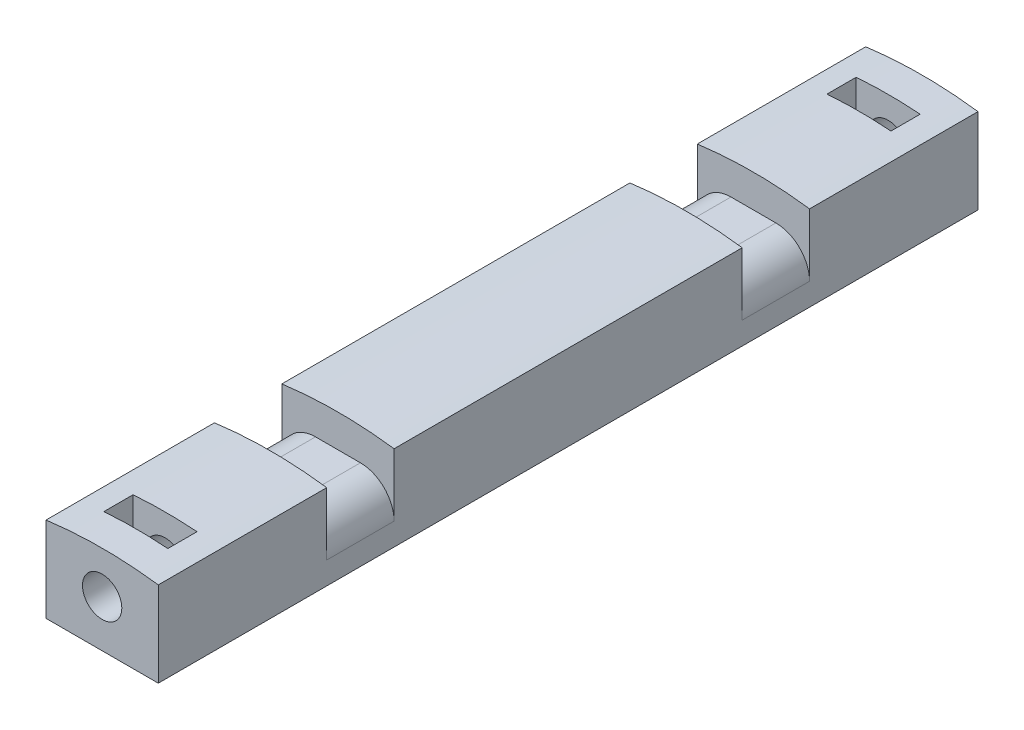
ISO-10303-21;
HEADER;
FILE_DESCRIPTION(('STEP AP214'),'2;1');
FILE_NAME('part.step','',(''),(''),'','','');
FILE_SCHEMA(('AUTOMOTIVE_DESIGN { 1 0 10303 214 1 1 1 1 }'));
ENDSEC;
DATA;
#1=APPLICATION_CONTEXT('core data for automotive mechanical design processes');
#2=APPLICATION_PROTOCOL_DEFINITION('international standard','automotive_design',2000,#1);
#3=PRODUCT_CONTEXT('',#1,'mechanical');
#4=PRODUCT('Part','Part','',(#3));
#5=PRODUCT_RELATED_PRODUCT_CATEGORY('part','',(#4));
#6=PRODUCT_DEFINITION_FORMATION('','',#4);
#7=PRODUCT_DEFINITION_CONTEXT('part definition',#1,'design');
#8=PRODUCT_DEFINITION('design','',#6,#7);
#9=PRODUCT_DEFINITION_SHAPE('','',#8);
#10=(LENGTH_UNIT() NAMED_UNIT(*) SI_UNIT(.MILLI.,.METRE.));
#11=(NAMED_UNIT(*) PLANE_ANGLE_UNIT() SI_UNIT($,.RADIAN.));
#12=(NAMED_UNIT(*) SI_UNIT($,.STERADIAN.) SOLID_ANGLE_UNIT());
#13=UNCERTAINTY_MEASURE_WITH_UNIT(LENGTH_MEASURE(1.E-05),#10,'distance_accuracy_value','');
#14=(GEOMETRIC_REPRESENTATION_CONTEXT(3) GLOBAL_UNCERTAINTY_ASSIGNED_CONTEXT((#13)) GLOBAL_UNIT_ASSIGNED_CONTEXT((#10,
#11,#12)) REPRESENTATION_CONTEXT('',''));
#15=CARTESIAN_POINT('',(0.,0.,0.));
#16=DIRECTION('',(0.,0.,1.));
#17=DIRECTION('',(1.,0.,0.));
#18=AXIS2_PLACEMENT_3D('',#15,#16,#17);
#19=CARTESIAN_POINT('',(0.,0.,73.));
#20=DIRECTION('',(0.,0.,-1.));
#21=DIRECTION('',(-1.,0.,0.));
#22=AXIS2_PLACEMENT_3D('',#19,#20,#21);
#23=CYLINDRICAL_SURFACE('',#22,37.5);
#24=CARTESIAN_POINT('',(0.,0.,58.));
#25=DIRECTION('',(0.,0.,1.));
#26=DIRECTION('',(1.,0.,0.));
#27=AXIS2_PLACEMENT_3D('',#24,#25,#26);
#28=CIRCLE('',#27,37.5);
#29=CARTESIAN_POINT('',(-5.,37.1651718682963,58.));
#30=VERTEX_POINT('',#29);
#31=CARTESIAN_POINT('',(5.,37.1651718682963,58.));
#32=VERTEX_POINT('',#31);
#33=EDGE_CURVE('E314',#30,#32,#28,.F.);
#34=ORIENTED_EDGE('',*,*,#33,.F.);
#35=DIRECTION('',(0.,0.,-1.));
#36=VECTOR('',#35,1.);
#37=CARTESIAN_POINT('',(-5.,37.1651718682963,73.));
#38=LINE('',#37,#36);
#39=CARTESIAN_POINT('',(-5.,37.1651718682963,73.));
#40=VERTEX_POINT('',#39);
#41=EDGE_CURVE('E367',#40,#30,#38,.T.);
#42=ORIENTED_EDGE('',*,*,#41,.F.);
#43=CARTESIAN_POINT('',(0.,0.,73.));
#44=DIRECTION('',(0.,0.,1.));
#45=DIRECTION('',(1.,0.,0.));
#46=AXIS2_PLACEMENT_3D('',#43,#44,#45);
#47=CIRCLE('',#46,37.5);
#48=CARTESIAN_POINT('',(5.,37.1651718682963,73.));
#49=VERTEX_POINT('',#48);
#50=EDGE_CURVE('E336',#40,#49,#47,.F.);
#51=ORIENTED_EDGE('',*,*,#50,.T.);
#52=DIRECTION('',(0.,0.,-1.));
#53=VECTOR('',#52,1.);
#54=CARTESIAN_POINT('',(5.,37.1651718682963,73.));
#55=LINE('',#54,#53);
#56=EDGE_CURVE('E357',#49,#32,#55,.T.);
#57=ORIENTED_EDGE('',*,*,#56,.T.);
#58=EDGE_LOOP('',(#34,#42,#51,#57));
#59=FACE_BOUND('',#58,.T.);
#60=DIRECTION('',(0.,0.,1.));
#61=VECTOR('',#60,1.);
#62=CARTESIAN_POINT('',(-2.85,37.3915431615225,67.4));
#63=LINE('',#62,#61);
#64=CARTESIAN_POINT('',(-2.85,37.3915431615225,67.4));
#65=VERTEX_POINT('',#64);
#66=CARTESIAN_POINT('',(-2.85,37.3915431615225,70.));
#67=VERTEX_POINT('',#66);
#68=EDGE_CURVE('E220',#65,#67,#63,.T.);
#69=ORIENTED_EDGE('',*,*,#68,.F.);
#70=CARTESIAN_POINT('',(0.,0.,67.4));
#71=DIRECTION('',(0.,0.,1.));
#72=DIRECTION('',(1.,0.,0.));
#73=AXIS2_PLACEMENT_3D('',#70,#71,#72);
#74=CIRCLE('',#73,37.5);
#75=CARTESIAN_POINT('',(2.85,37.3915431615225,67.4));
#76=VERTEX_POINT('',#75);
#77=EDGE_CURVE('E227',#76,#65,#74,.T.);
#78=ORIENTED_EDGE('',*,*,#77,.F.);
#79=DIRECTION('',(0.,0.,1.));
#80=VECTOR('',#79,1.);
#81=CARTESIAN_POINT('',(2.85,37.3915431615225,67.4));
#82=LINE('',#81,#80);
#83=CARTESIAN_POINT('',(2.85,37.3915431615225,70.));
#84=VERTEX_POINT('',#83);
#85=EDGE_CURVE('E419',#76,#84,#82,.T.);
#86=ORIENTED_EDGE('',*,*,#85,.T.);
#87=CARTESIAN_POINT('',(0.,0.,70.));
#88=DIRECTION('',(0.,0.,1.));
#89=DIRECTION('',(1.,0.,0.));
#90=AXIS2_PLACEMENT_3D('',#87,#88,#89);
#91=CIRCLE('',#90,37.5);
#92=EDGE_CURVE('E240',#84,#67,#91,.T.);
#93=ORIENTED_EDGE('',*,*,#92,.T.);
#94=EDGE_LOOP('',(#69,#78,#86,#93));
#95=FACE_BOUND('',#94,.T.);
#96=ADVANCED_FACE('F41',(#59,#95),#23,.T.);
#97=CARTESIAN_POINT('',(0.,0.,15.));
#98=DIRECTION('',(0.,0.,-1.));
#99=DIRECTION('',(-1.,0.,0.));
#100=AXIS2_PLACEMENT_3D('',#97,#98,#99);
#101=CIRCLE('',#100,37.5);
#102=CARTESIAN_POINT('',(5.,37.1651718682963,15.));
#103=VERTEX_POINT('',#102);
#104=CARTESIAN_POINT('',(-5.,37.1651718682963,15.));
#105=VERTEX_POINT('',#104);
#106=EDGE_CURVE('E333',#103,#105,#101,.F.);
#107=ORIENTED_EDGE('',*,*,#106,.F.);
#108=CARTESIAN_POINT('',(5.,37.1651718682963,0.));
#109=VERTEX_POINT('',#108);
#110=EDGE_CURVE('E347',#103,#109,#55,.T.);
#111=ORIENTED_EDGE('',*,*,#110,.T.);
#112=CARTESIAN_POINT('',(0.,0.,0.));
#113=DIRECTION('',(0.,0.,1.));
#114=DIRECTION('',(1.,0.,0.));
#115=AXIS2_PLACEMENT_3D('',#112,#113,#114);
#116=CIRCLE('',#115,37.5);
#117=CARTESIAN_POINT('',(-5.,37.1651718682963,0.));
#118=VERTEX_POINT('',#117);
#119=EDGE_CURVE('E335',#118,#109,#116,.F.);
#120=ORIENTED_EDGE('',*,*,#119,.F.);
#121=EDGE_CURVE('E366',#105,#118,#38,.T.);
#122=ORIENTED_EDGE('',*,*,#121,.F.);
#123=EDGE_LOOP('',(#107,#111,#120,#122));
#124=FACE_BOUND('',#123,.T.);
#125=DIRECTION('',(0.,0.,-1.));
#126=VECTOR('',#125,1.);
#127=CARTESIAN_POINT('',(2.85,37.3915431615225,5.6));
#128=LINE('',#127,#126);
#129=CARTESIAN_POINT('',(2.85,37.3915431615225,5.6));
#130=VERTEX_POINT('',#129);
#131=CARTESIAN_POINT('',(2.85,37.3915431615225,3.));
#132=VERTEX_POINT('',#131);
#133=EDGE_CURVE('E264',#130,#132,#128,.T.);
#134=ORIENTED_EDGE('',*,*,#133,.F.);
#135=CARTESIAN_POINT('',(0.,0.,5.6));
#136=DIRECTION('',(0.,0.,-1.));
#137=DIRECTION('',(-1.,0.,0.));
#138=AXIS2_PLACEMENT_3D('',#135,#136,#137);
#139=CIRCLE('',#138,37.5);
#140=CARTESIAN_POINT('',(-2.85,37.3915431615225,5.6));
#141=VERTEX_POINT('',#140);
#142=EDGE_CURVE('E248',#141,#130,#139,.T.);
#143=ORIENTED_EDGE('',*,*,#142,.F.);
#144=DIRECTION('',(0.,0.,-1.));
#145=VECTOR('',#144,1.);
#146=CARTESIAN_POINT('',(-2.85,37.3915431615225,5.6));
#147=LINE('',#146,#145);
#148=CARTESIAN_POINT('',(-2.85,37.3915431615225,3.));
#149=VERTEX_POINT('',#148);
#150=EDGE_CURVE('E277',#141,#149,#147,.T.);
#151=ORIENTED_EDGE('',*,*,#150,.T.);
#152=CARTESIAN_POINT('',(0.,0.,3.));
#153=DIRECTION('',(0.,0.,-1.));
#154=DIRECTION('',(-1.,0.,0.));
#155=AXIS2_PLACEMENT_3D('',#152,#153,#154);
#156=CIRCLE('',#155,37.5);
#157=EDGE_CURVE('E265',#149,#132,#156,.T.);
#158=ORIENTED_EDGE('',*,*,#157,.T.);
#159=EDGE_LOOP('',(#134,#143,#151,#158));
#160=FACE_BOUND('',#159,.T.);
#161=ADVANCED_FACE('F458',(#124,#160),#23,.T.);
#162=CARTESIAN_POINT('',(0.,0.,21.));
#163=DIRECTION('',(0.,0.,1.));
#164=DIRECTION('',(1.,0.,0.));
#165=AXIS2_PLACEMENT_3D('',#162,#163,#164);
#166=CIRCLE('',#165,37.5);
#167=CARTESIAN_POINT('',(-5.,37.1651718682963,21.));
#168=VERTEX_POINT('',#167);
#169=CARTESIAN_POINT('',(5.,37.1651718682963,21.));
#170=VERTEX_POINT('',#169);
#171=EDGE_CURVE('E331',#168,#170,#166,.F.);
#172=ORIENTED_EDGE('',*,*,#171,.F.);
#173=CARTESIAN_POINT('',(-5.,37.1651718682963,52.));
#174=VERTEX_POINT('',#173);
#175=EDGE_CURVE('E371',#174,#168,#38,.T.);
#176=ORIENTED_EDGE('',*,*,#175,.F.);
#177=CARTESIAN_POINT('',(0.,0.,52.));
#178=DIRECTION('',(0.,0.,-1.));
#179=DIRECTION('',(-1.,0.,0.));
#180=AXIS2_PLACEMENT_3D('',#177,#178,#179);
#181=CIRCLE('',#180,37.5);
#182=CARTESIAN_POINT('',(5.,37.1651718682963,52.));
#183=VERTEX_POINT('',#182);
#184=EDGE_CURVE('E329',#183,#174,#181,.F.);
#185=ORIENTED_EDGE('',*,*,#184,.F.);
#186=EDGE_CURVE('E361',#183,#170,#55,.T.);
#187=ORIENTED_EDGE('',*,*,#186,.T.);
#188=EDGE_LOOP('',(#172,#176,#185,#187));
#189=FACE_BOUND('',#188,.T.);
#190=ADVANCED_FACE('F461',(#189),#23,.T.);
#191=CARTESIAN_POINT('',(-4.99999999999999,0.,73.));
#192=DIRECTION('',(-1.,0.,0.));
#193=DIRECTION('',(0.,-1.,0.));
#194=AXIS2_PLACEMENT_3D('',#191,#192,#193);
#195=PLANE('',#194);
#196=DIRECTION('',(0.,1.,0.));
#197=VECTOR('',#196,1.);
#198=CARTESIAN_POINT('',(-4.99999999999999,34.5803989154981,58.));
#199=LINE('',#198,#197);
#200=CARTESIAN_POINT('',(-5.,31.5803989154981,58.));
#201=VERTEX_POINT('',#200);
#202=EDGE_CURVE('E323',#201,#30,#199,.T.);
#203=ORIENTED_EDGE('',*,*,#202,.F.);
#204=DIRECTION('',(0.,0.,1.));
#205=VECTOR('',#204,1.);
#206=CARTESIAN_POINT('',(-5.,31.5803989154981,52.));
#207=LINE('',#206,#205);
#208=CARTESIAN_POINT('',(-4.99999999999999,31.5803989154981,52.));
#209=VERTEX_POINT('',#208);
#210=EDGE_CURVE('E389',#201,#209,#207,.F.);
#211=ORIENTED_EDGE('',*,*,#210,.T.);
#212=DIRECTION('',(0.,-1.,0.));
#213=VECTOR('',#212,1.);
#214=CARTESIAN_POINT('',(-4.99999999999999,34.5803989154981,52.));
#215=LINE('',#214,#213);
#216=EDGE_CURVE('E309',#174,#209,#215,.T.);
#217=ORIENTED_EDGE('',*,*,#216,.F.);
#218=ORIENTED_EDGE('',*,*,#175,.T.);
#219=DIRECTION('',(0.,1.,0.));
#220=VECTOR('',#219,1.);
#221=CARTESIAN_POINT('',(-4.99999999999999,34.5803989154981,21.));
#222=LINE('',#221,#220);
#223=CARTESIAN_POINT('',(-5.,31.5803989154981,21.));
#224=VERTEX_POINT('',#223);
#225=EDGE_CURVE('E306',#224,#168,#222,.T.);
#226=ORIENTED_EDGE('',*,*,#225,.F.);
#227=DIRECTION('',(0.,0.,1.));
#228=VECTOR('',#227,1.);
#229=CARTESIAN_POINT('',(-5.,31.5803989154981,15.));
#230=LINE('',#229,#228);
#231=CARTESIAN_POINT('',(-4.99999999999999,31.5803989154981,15.));
#232=VERTEX_POINT('',#231);
#233=EDGE_CURVE('E386',#224,#232,#230,.F.);
#234=ORIENTED_EDGE('',*,*,#233,.T.);
#235=DIRECTION('',(0.,-1.,0.));
#236=VECTOR('',#235,1.);
#237=CARTESIAN_POINT('',(-4.99999999999999,34.5803989154981,15.));
#238=LINE('',#237,#236);
#239=EDGE_CURVE('E307',#105,#232,#238,.T.);
#240=ORIENTED_EDGE('',*,*,#239,.F.);
#241=ORIENTED_EDGE('',*,*,#121,.T.);
#242=DIRECTION('',(0.,1.,0.));
#243=VECTOR('',#242,1.);
#244=CARTESIAN_POINT('',(-4.99999999999999,0.,0.));
#245=LINE('',#244,#243);
#246=CARTESIAN_POINT('',(-5.,29.5803989154981,0.));
#247=VERTEX_POINT('',#246);
#248=EDGE_CURVE('E350',#247,#118,#245,.T.);
#249=ORIENTED_EDGE('',*,*,#248,.F.);
#250=DIRECTION('',(0.,0.,-1.));
#251=VECTOR('',#250,1.);
#252=CARTESIAN_POINT('',(-5.,29.5803989154981,73.));
#253=LINE('',#252,#251);
#254=CARTESIAN_POINT('',(-5.,29.5803989154981,73.));
#255=VERTEX_POINT('',#254);
#256=EDGE_CURVE('E364',#255,#247,#253,.T.);
#257=ORIENTED_EDGE('',*,*,#256,.F.);
#258=DIRECTION('',(0.,1.,0.));
#259=VECTOR('',#258,1.);
#260=CARTESIAN_POINT('',(-4.99999999999999,0.,73.));
#261=LINE('',#260,#259);
#262=EDGE_CURVE('E339',#255,#40,#261,.T.);
#263=ORIENTED_EDGE('',*,*,#262,.T.);
#264=ORIENTED_EDGE('',*,*,#41,.T.);
#265=EDGE_LOOP('',(#203,#211,#217,#218,#226,#234,#240,#241,#249,#257,#263,#264));
#266=FACE_BOUND('',#265,.T.);
#267=ADVANCED_FACE('F472',(#266),#195,.T.);
#268=CARTESIAN_POINT('',(0.,29.5803989154981,73.));
#269=DIRECTION('',(0.,1.,0.));
#270=DIRECTION('',(0.,0.,1.));
#271=AXIS2_PLACEMENT_3D('',#268,#269,#270);
#272=PLANE('',#271);
#273=DIRECTION('',(1.,0.,0.));
#274=VECTOR('',#273,1.);
#275=CARTESIAN_POINT('',(0.,29.5803989154981,0.));
#276=LINE('',#275,#274);
#277=CARTESIAN_POINT('',(5.,29.5803989154981,0.));
#278=VERTEX_POINT('',#277);
#279=EDGE_CURVE('E353',#247,#278,#276,.T.);
#280=ORIENTED_EDGE('',*,*,#279,.T.);
#281=DIRECTION('',(0.,0.,-1.));
#282=VECTOR('',#281,1.);
#283=CARTESIAN_POINT('',(5.,29.5803989154981,73.));
#284=LINE('',#283,#282);
#285=CARTESIAN_POINT('',(5.,29.5803989154981,73.));
#286=VERTEX_POINT('',#285);
#287=EDGE_CURVE('E360',#286,#278,#284,.T.);
#288=ORIENTED_EDGE('',*,*,#287,.F.);
#289=DIRECTION('',(1.,0.,0.));
#290=VECTOR('',#289,1.);
#291=CARTESIAN_POINT('',(0.,29.5803989154981,73.));
#292=LINE('',#291,#290);
#293=EDGE_CURVE('E343',#255,#286,#292,.T.);
#294=ORIENTED_EDGE('',*,*,#293,.F.);
#295=ORIENTED_EDGE('',*,*,#256,.T.);
#296=EDGE_LOOP('',(#280,#288,#294,#295));
#297=FACE_BOUND('',#296,.T.);
#298=ADVANCED_FACE('F479',(#297),#272,.F.);
#299=CARTESIAN_POINT('',(4.99999999999999,0.,73.));
#300=DIRECTION('',(-1.,0.,0.));
#301=DIRECTION('',(0.,-1.,0.));
#302=AXIS2_PLACEMENT_3D('',#299,#300,#301);
#303=PLANE('',#302);
#304=DIRECTION('',(0.,0.,1.));
#305=VECTOR('',#304,1.);
#306=CARTESIAN_POINT('',(5.,31.5803989154981,73.));
#307=LINE('',#306,#305);
#308=CARTESIAN_POINT('',(5.,31.5803989154981,52.));
#309=VERTEX_POINT('',#308);
#310=CARTESIAN_POINT('',(5.,31.5803989154981,58.));
#311=VERTEX_POINT('',#310);
#312=EDGE_CURVE('E378',#309,#311,#307,.T.);
#313=ORIENTED_EDGE('',*,*,#312,.T.);
#314=DIRECTION('',(0.,1.,0.));
#315=VECTOR('',#314,1.);
#316=CARTESIAN_POINT('',(5.,34.5803989154981,58.));
#317=LINE('',#316,#315);
#318=EDGE_CURVE('E320',#311,#32,#317,.T.);
#319=ORIENTED_EDGE('',*,*,#318,.T.);
#320=ORIENTED_EDGE('',*,*,#56,.F.);
#321=DIRECTION('',(0.,1.,0.));
#322=VECTOR('',#321,1.);
#323=CARTESIAN_POINT('',(4.99999999999999,0.,73.));
#324=LINE('',#323,#322);
#325=EDGE_CURVE('E345',#286,#49,#324,.T.);
#326=ORIENTED_EDGE('',*,*,#325,.F.);
#327=ORIENTED_EDGE('',*,*,#287,.T.);
#328=DIRECTION('',(0.,1.,0.));
#329=VECTOR('',#328,1.);
#330=CARTESIAN_POINT('',(4.99999999999999,0.,0.));
#331=LINE('',#330,#329);
#332=EDGE_CURVE('E340',#278,#109,#331,.T.);
#333=ORIENTED_EDGE('',*,*,#332,.T.);
#334=ORIENTED_EDGE('',*,*,#110,.F.);
#335=DIRECTION('',(0.,-1.,0.));
#336=VECTOR('',#335,1.);
#337=CARTESIAN_POINT('',(4.99999999999999,0.,15.));
#338=LINE('',#337,#336);
#339=CARTESIAN_POINT('',(5.,31.5803989154981,15.));
#340=VERTEX_POINT('',#339);
#341=EDGE_CURVE('E373',#103,#340,#338,.T.);
#342=ORIENTED_EDGE('',*,*,#341,.T.);
#343=DIRECTION('',(0.,0.,1.));
#344=VECTOR('',#343,1.);
#345=CARTESIAN_POINT('',(5.,31.5803989154981,73.));
#346=LINE('',#345,#344);
#347=CARTESIAN_POINT('',(5.,31.5803989154981,21.));
#348=VERTEX_POINT('',#347);
#349=EDGE_CURVE('E375',#340,#348,#346,.T.);
#350=ORIENTED_EDGE('',*,*,#349,.T.);
#351=DIRECTION('',(0.,1.,0.));
#352=VECTOR('',#351,1.);
#353=CARTESIAN_POINT('',(5.,34.5803989154981,21.));
#354=LINE('',#353,#352);
#355=EDGE_CURVE('E302',#348,#170,#354,.T.);
#356=ORIENTED_EDGE('',*,*,#355,.T.);
#357=ORIENTED_EDGE('',*,*,#186,.F.);
#358=DIRECTION('',(0.,-1.,0.));
#359=VECTOR('',#358,1.);
#360=CARTESIAN_POINT('',(4.99999999999999,0.,52.));
#361=LINE('',#360,#359);
#362=EDGE_CURVE('E370',#183,#309,#361,.T.);
#363=ORIENTED_EDGE('',*,*,#362,.T.);
#364=EDGE_LOOP('',(#313,#319,#320,#326,#327,#333,#334,#342,#350,#356,#357,#363));
#365=FACE_BOUND('',#364,.T.);
#366=ADVANCED_FACE('F505',(#365),#303,.F.);
#367=CARTESIAN_POINT('',(0.,0.,73.));
#368=DIRECTION('',(0.,0.,1.));
#369=DIRECTION('',(1.,0.,0.));
#370=AXIS2_PLACEMENT_3D('',#367,#368,#369);
#371=PLANE('',#370);
#372=CARTESIAN_POINT('',(0.,33.75,73.));
#373=DIRECTION('',(0.,0.,1.));
#374=DIRECTION('',(1.,0.,0.));
#375=AXIS2_PLACEMENT_3D('',#372,#373,#374);
#376=CIRCLE('',#375,1.75);
#377=CARTESIAN_POINT('',(1.75,33.75,73.));
#378=VERTEX_POINT('',#377);
#379=EDGE_CURVE('E291',#378,#378,#376,.T.);
#380=ORIENTED_EDGE('',*,*,#379,.F.);
#381=EDGE_LOOP('',(#380));
#382=FACE_BOUND('',#381,.T.);
#383=ORIENTED_EDGE('',*,*,#50,.F.);
#384=ORIENTED_EDGE('',*,*,#262,.F.);
#385=ORIENTED_EDGE('',*,*,#293,.T.);
#386=ORIENTED_EDGE('',*,*,#325,.T.);
#387=EDGE_LOOP('',(#383,#384,#385,#386));
#388=FACE_BOUND('',#387,.T.);
#389=ADVANCED_FACE('F509',(#382,#388),#371,.T.);
#390=CARTESIAN_POINT('',(0.,0.,0.));
#391=DIRECTION('',(0.,0.,1.));
#392=DIRECTION('',(1.,0.,0.));
#393=AXIS2_PLACEMENT_3D('',#390,#391,#392);
#394=PLANE('',#393);
#395=CARTESIAN_POINT('',(0.,33.75,0.));
#396=DIRECTION('',(0.,0.,-1.));
#397=DIRECTION('',(-1.,0.,0.));
#398=AXIS2_PLACEMENT_3D('',#395,#396,#397);
#399=CIRCLE('',#398,1.75);
#400=CARTESIAN_POINT('',(-1.75,33.75,0.));
#401=VERTEX_POINT('',#400);
#402=EDGE_CURVE('E292',#401,#401,#399,.T.);
#403=ORIENTED_EDGE('',*,*,#402,.F.);
#404=EDGE_LOOP('',(#403));
#405=FACE_BOUND('',#404,.T.);
#406=ORIENTED_EDGE('',*,*,#119,.T.);
#407=ORIENTED_EDGE('',*,*,#332,.F.);
#408=ORIENTED_EDGE('',*,*,#279,.F.);
#409=ORIENTED_EDGE('',*,*,#248,.T.);
#410=EDGE_LOOP('',(#406,#407,#408,#409));
#411=FACE_BOUND('',#410,.T.);
#412=ADVANCED_FACE('F499',(#405,#411),#394,.F.);
#413=CARTESIAN_POINT('',(5.,34.5803989154981,52.));
#414=DIRECTION('',(0.,0.,-1.));
#415=DIRECTION('',(-1.,0.,0.));
#416=AXIS2_PLACEMENT_3D('',#413,#414,#415);
#417=PLANE('',#416);
#418=ORIENTED_EDGE('',*,*,#184,.T.);
#419=ORIENTED_EDGE('',*,*,#216,.T.);
#420=CARTESIAN_POINT('',(-2.,31.5803989154981,52.));
#421=DIRECTION('',(0.,0.,-1.));
#422=DIRECTION('',(-1.,0.,0.));
#423=AXIS2_PLACEMENT_3D('',#420,#421,#422);
#424=CIRCLE('',#423,3.);
#425=CARTESIAN_POINT('',(-2.,34.5803989154981,52.));
#426=VERTEX_POINT('',#425);
#427=EDGE_CURVE('E405',#209,#426,#424,.T.);
#428=ORIENTED_EDGE('',*,*,#427,.T.);
#429=DIRECTION('',(-1.,0.,0.));
#430=VECTOR('',#429,1.);
#431=CARTESIAN_POINT('',(5.,34.5803989154981,52.));
#432=LINE('',#431,#430);
#433=CARTESIAN_POINT('',(2.,34.5803989154981,52.));
#434=VERTEX_POINT('',#433);
#435=EDGE_CURVE('E317',#434,#426,#432,.T.);
#436=ORIENTED_EDGE('',*,*,#435,.F.);
#437=CARTESIAN_POINT('',(2.,31.5803989154981,52.));
#438=DIRECTION('',(0.,0.,-1.));
#439=DIRECTION('',(-1.,0.,0.));
#440=AXIS2_PLACEMENT_3D('',#437,#438,#439);
#441=CIRCLE('',#440,3.);
#442=EDGE_CURVE('E399',#434,#309,#441,.T.);
#443=ORIENTED_EDGE('',*,*,#442,.T.);
#444=ORIENTED_EDGE('',*,*,#362,.F.);
#445=EDGE_LOOP('',(#418,#419,#428,#436,#443,#444));
#446=FACE_BOUND('',#445,.T.);
#447=ADVANCED_FACE('F529',(#446),#417,.F.);
#448=CARTESIAN_POINT('',(5.,34.5803989154981,58.));
#449=DIRECTION('',(0.,0.,1.));
#450=DIRECTION('',(1.,0.,0.));
#451=AXIS2_PLACEMENT_3D('',#448,#449,#450);
#452=PLANE('',#451);
#453=ORIENTED_EDGE('',*,*,#33,.T.);
#454=ORIENTED_EDGE('',*,*,#318,.F.);
#455=CARTESIAN_POINT('',(2.,31.5803989154981,58.));
#456=DIRECTION('',(0.,0.,1.));
#457=DIRECTION('',(1.,0.,0.));
#458=AXIS2_PLACEMENT_3D('',#455,#456,#457);
#459=CIRCLE('',#458,3.);
#460=CARTESIAN_POINT('',(2.,34.5803989154981,58.));
#461=VERTEX_POINT('',#460);
#462=EDGE_CURVE('E397',#311,#461,#459,.T.);
#463=ORIENTED_EDGE('',*,*,#462,.T.);
#464=DIRECTION('',(-1.,0.,0.));
#465=VECTOR('',#464,1.);
#466=CARTESIAN_POINT('',(5.,34.5803989154981,58.));
#467=LINE('',#466,#465);
#468=CARTESIAN_POINT('',(-2.,34.5803989154981,58.));
#469=VERTEX_POINT('',#468);
#470=EDGE_CURVE('E299',#461,#469,#467,.T.);
#471=ORIENTED_EDGE('',*,*,#470,.T.);
#472=CARTESIAN_POINT('',(-2.,31.5803989154981,58.));
#473=DIRECTION('',(0.,0.,1.));
#474=DIRECTION('',(1.,0.,0.));
#475=AXIS2_PLACEMENT_3D('',#472,#473,#474);
#476=CIRCLE('',#475,3.);
#477=EDGE_CURVE('E402',#469,#201,#476,.T.);
#478=ORIENTED_EDGE('',*,*,#477,.T.);
#479=ORIENTED_EDGE('',*,*,#202,.T.);
#480=EDGE_LOOP('',(#453,#454,#463,#471,#478,#479));
#481=FACE_BOUND('',#480,.T.);
#482=ADVANCED_FACE('F512',(#481),#452,.F.);
#483=CARTESIAN_POINT('',(5.,34.5803989154981,52.));
#484=DIRECTION('',(0.,-1.,0.));
#485=DIRECTION('',(1.,0.,0.));
#486=AXIS2_PLACEMENT_3D('',#483,#484,#485);
#487=PLANE('',#486);
#488=ORIENTED_EDGE('',*,*,#470,.F.);
#489=DIRECTION('',(0.,0.,1.));
#490=VECTOR('',#489,1.);
#491=CARTESIAN_POINT('',(2.,34.5803989154981,52.));
#492=LINE('',#491,#490);
#493=EDGE_CURVE('E384',#461,#434,#492,.F.);
#494=ORIENTED_EDGE('',*,*,#493,.T.);
#495=ORIENTED_EDGE('',*,*,#435,.T.);
#496=DIRECTION('',(0.,0.,1.));
#497=VECTOR('',#496,1.);
#498=CARTESIAN_POINT('',(-2.,34.5803989154981,58.));
#499=LINE('',#498,#497);
#500=EDGE_CURVE('E381',#426,#469,#499,.T.);
#501=ORIENTED_EDGE('',*,*,#500,.T.);
#502=EDGE_LOOP('',(#488,#494,#495,#501));
#503=FACE_BOUND('',#502,.T.);
#504=ADVANCED_FACE('F521',(#503),#487,.F.);
#505=CARTESIAN_POINT('',(5.,34.5803989154981,15.));
#506=DIRECTION('',(0.,0.,-1.));
#507=DIRECTION('',(-1.,0.,0.));
#508=AXIS2_PLACEMENT_3D('',#505,#506,#507);
#509=PLANE('',#508);
#510=ORIENTED_EDGE('',*,*,#106,.T.);
#511=ORIENTED_EDGE('',*,*,#239,.T.);
#512=CARTESIAN_POINT('',(-2.,31.5803989154981,15.));
#513=DIRECTION('',(0.,0.,-1.));
#514=DIRECTION('',(-1.,0.,0.));
#515=AXIS2_PLACEMENT_3D('',#512,#513,#514);
#516=CIRCLE('',#515,3.);
#517=CARTESIAN_POINT('',(-2.,34.5803989154981,15.));
#518=VERTEX_POINT('',#517);
#519=EDGE_CURVE('E11',#232,#518,#516,.T.);
#520=ORIENTED_EDGE('',*,*,#519,.T.);
#521=DIRECTION('',(-1.,0.,0.));
#522=VECTOR('',#521,1.);
#523=CARTESIAN_POINT('',(5.,34.5803989154981,15.));
#524=LINE('',#523,#522);
#525=CARTESIAN_POINT('',(2.,34.5803989154981,15.));
#526=VERTEX_POINT('',#525);
#527=EDGE_CURVE('E305',#526,#518,#524,.T.);
#528=ORIENTED_EDGE('',*,*,#527,.F.);
#529=CARTESIAN_POINT('',(2.,31.5803989154981,15.));
#530=DIRECTION('',(0.,0.,-1.));
#531=DIRECTION('',(-1.,0.,0.));
#532=AXIS2_PLACEMENT_3D('',#529,#530,#531);
#533=CIRCLE('',#532,3.);
#534=EDGE_CURVE('E409',#526,#340,#533,.T.);
#535=ORIENTED_EDGE('',*,*,#534,.T.);
#536=ORIENTED_EDGE('',*,*,#341,.F.);
#537=EDGE_LOOP('',(#510,#511,#520,#528,#535,#536));
#538=FACE_BOUND('',#537,.T.);
#539=ADVANCED_FACE('F543',(#538),#509,.F.);
#540=CARTESIAN_POINT('',(5.,34.5803989154981,21.));
#541=DIRECTION('',(0.,0.,1.));
#542=DIRECTION('',(1.,0.,0.));
#543=AXIS2_PLACEMENT_3D('',#540,#541,#542);
#544=PLANE('',#543);
#545=ORIENTED_EDGE('',*,*,#171,.T.);
#546=ORIENTED_EDGE('',*,*,#355,.F.);
#547=CARTESIAN_POINT('',(2.,31.5803989154981,21.));
#548=DIRECTION('',(0.,0.,1.));
#549=DIRECTION('',(1.,0.,0.));
#550=AXIS2_PLACEMENT_3D('',#547,#548,#549);
#551=CIRCLE('',#550,3.);
#552=CARTESIAN_POINT('',(2.,34.5803989154981,21.));
#553=VERTEX_POINT('',#552);
#554=EDGE_CURVE('E407',#348,#553,#551,.T.);
#555=ORIENTED_EDGE('',*,*,#554,.T.);
#556=DIRECTION('',(-1.,0.,0.));
#557=VECTOR('',#556,1.);
#558=CARTESIAN_POINT('',(5.,34.5803989154981,21.));
#559=LINE('',#558,#557);
#560=CARTESIAN_POINT('',(-2.,34.5803989154981,21.));
#561=VERTEX_POINT('',#560);
#562=EDGE_CURVE('E311',#553,#561,#559,.T.);
#563=ORIENTED_EDGE('',*,*,#562,.T.);
#564=CARTESIAN_POINT('',(-2.,31.5803989154981,21.));
#565=DIRECTION('',(0.,0.,1.));
#566=DIRECTION('',(1.,0.,0.));
#567=AXIS2_PLACEMENT_3D('',#564,#565,#566);
#568=CIRCLE('',#567,3.);
#569=EDGE_CURVE('E50',#561,#224,#568,.T.);
#570=ORIENTED_EDGE('',*,*,#569,.T.);
#571=ORIENTED_EDGE('',*,*,#225,.T.);
#572=EDGE_LOOP('',(#545,#546,#555,#563,#570,#571));
#573=FACE_BOUND('',#572,.T.);
#574=ADVANCED_FACE('F532',(#573),#544,.F.);
#575=CARTESIAN_POINT('',(5.,34.5803989154981,15.));
#576=DIRECTION('',(0.,-1.,0.));
#577=DIRECTION('',(1.,0.,0.));
#578=AXIS2_PLACEMENT_3D('',#575,#576,#577);
#579=PLANE('',#578);
#580=ORIENTED_EDGE('',*,*,#562,.F.);
#581=DIRECTION('',(0.,0.,1.));
#582=VECTOR('',#581,1.);
#583=CARTESIAN_POINT('',(2.,34.5803989154981,15.));
#584=LINE('',#583,#582);
#585=EDGE_CURVE('E395',#553,#526,#584,.F.);
#586=ORIENTED_EDGE('',*,*,#585,.T.);
#587=ORIENTED_EDGE('',*,*,#527,.T.);
#588=DIRECTION('',(0.,0.,1.));
#589=VECTOR('',#588,1.);
#590=CARTESIAN_POINT('',(-2.,34.5803989154981,21.));
#591=LINE('',#590,#589);
#592=EDGE_CURVE('E392',#518,#561,#591,.T.);
#593=ORIENTED_EDGE('',*,*,#592,.T.);
#594=EDGE_LOOP('',(#580,#586,#587,#593));
#595=FACE_BOUND('',#594,.T.);
#596=ADVANCED_FACE('F540',(#595),#579,.F.);
#597=CARTESIAN_POINT('',(0.,33.75,61.));
#598=DIRECTION('',(0.,0.,1.));
#599=DIRECTION('',(1.,0.,0.));
#600=AXIS2_PLACEMENT_3D('',#597,#598,#599);
#601=CYLINDRICAL_SURFACE('',#600,1.75);
#602=CARTESIAN_POINT('',(0.,33.75,70.));
#603=DIRECTION('',(0.,0.,1.));
#604=DIRECTION('',(1.,0.,0.));
#605=AXIS2_PLACEMENT_3D('',#602,#603,#604);
#606=CIRCLE('',#605,1.75);
#607=CARTESIAN_POINT('',(1.75,33.75,70.));
#608=VERTEX_POINT('',#607);
#609=EDGE_CURVE('E417',#608,#608,#606,.F.);
#610=ORIENTED_EDGE('',*,*,#609,.T.);
#611=EDGE_LOOP('',(#610));
#612=FACE_BOUND('',#611,.T.);
#613=ORIENTED_EDGE('',*,*,#379,.T.);
#614=EDGE_LOOP('',(#613));
#615=FACE_BOUND('',#614,.T.);
#616=ADVANCED_FACE('F566',(#612,#615),#601,.F.);
#617=CARTESIAN_POINT('',(0.,33.75,12.));
#618=DIRECTION('',(0.,0.,-1.));
#619=DIRECTION('',(-1.,0.,0.));
#620=AXIS2_PLACEMENT_3D('',#617,#618,#619);
#621=CYLINDRICAL_SURFACE('',#620,1.75);
#622=CARTESIAN_POINT('',(0.,33.75,3.));
#623=DIRECTION('',(0.,0.,-1.));
#624=DIRECTION('',(-1.,0.,0.));
#625=AXIS2_PLACEMENT_3D('',#622,#623,#624);
#626=CIRCLE('',#625,1.75);
#627=CARTESIAN_POINT('',(-1.75,33.75,3.));
#628=VERTEX_POINT('',#627);
#629=EDGE_CURVE('E280',#628,#628,#626,.F.);
#630=ORIENTED_EDGE('',*,*,#629,.T.);
#631=EDGE_LOOP('',(#630));
#632=FACE_BOUND('',#631,.T.);
#633=ORIENTED_EDGE('',*,*,#402,.T.);
#634=EDGE_LOOP('',(#633));
#635=FACE_BOUND('',#634,.T.);
#636=ADVANCED_FACE('F561',(#632,#635),#621,.F.);
#637=CARTESIAN_POINT('',(2.,31.5803989154981,73.));
#638=DIRECTION('',(0.,0.,1.));
#639=DIRECTION('',(1.,0.,0.));
#640=AXIS2_PLACEMENT_3D('',#637,#638,#639);
#641=CYLINDRICAL_SURFACE('',#640,3.);
#642=ORIENTED_EDGE('',*,*,#442,.F.);
#643=ORIENTED_EDGE('',*,*,#493,.F.);
#644=ORIENTED_EDGE('',*,*,#462,.F.);
#645=ORIENTED_EDGE('',*,*,#312,.F.);
#646=EDGE_LOOP('',(#642,#643,#644,#645));
#647=FACE_BOUND('',#646,.T.);
#648=ADVANCED_FACE('F517',(#647),#641,.T.);
#649=CARTESIAN_POINT('',(-2.,31.5803989154981,52.));
#650=DIRECTION('',(0.,0.,-1.));
#651=DIRECTION('',(-1.,0.,0.));
#652=AXIS2_PLACEMENT_3D('',#649,#650,#651);
#653=CYLINDRICAL_SURFACE('',#652,3.);
#654=ORIENTED_EDGE('',*,*,#427,.F.);
#655=ORIENTED_EDGE('',*,*,#210,.F.);
#656=ORIENTED_EDGE('',*,*,#477,.F.);
#657=ORIENTED_EDGE('',*,*,#500,.F.);
#658=EDGE_LOOP('',(#654,#655,#656,#657));
#659=FACE_BOUND('',#658,.T.);
#660=ADVANCED_FACE('F526',(#659),#653,.T.);
#661=CARTESIAN_POINT('',(2.,31.5803989154981,73.));
#662=DIRECTION('',(0.,0.,1.));
#663=DIRECTION('',(1.,0.,0.));
#664=AXIS2_PLACEMENT_3D('',#661,#662,#663);
#665=CYLINDRICAL_SURFACE('',#664,3.);
#666=ORIENTED_EDGE('',*,*,#534,.F.);
#667=ORIENTED_EDGE('',*,*,#585,.F.);
#668=ORIENTED_EDGE('',*,*,#554,.F.);
#669=ORIENTED_EDGE('',*,*,#349,.F.);
#670=EDGE_LOOP('',(#666,#667,#668,#669));
#671=FACE_BOUND('',#670,.T.);
#672=ADVANCED_FACE('F537',(#671),#665,.T.);
#673=CARTESIAN_POINT('',(-2.,31.5803989154981,15.));
#674=DIRECTION('',(0.,0.,-1.));
#675=DIRECTION('',(-1.,0.,0.));
#676=AXIS2_PLACEMENT_3D('',#673,#674,#675);
#677=CYLINDRICAL_SURFACE('',#676,3.);
#678=ORIENTED_EDGE('',*,*,#519,.F.);
#679=ORIENTED_EDGE('',*,*,#233,.F.);
#680=ORIENTED_EDGE('',*,*,#569,.F.);
#681=ORIENTED_EDGE('',*,*,#592,.F.);
#682=EDGE_LOOP('',(#678,#679,#680,#681));
#683=FACE_BOUND('',#682,.T.);
#684=ADVANCED_FACE('F43',(#683),#677,.T.);
#685=CARTESIAN_POINT('',(0.,0.,5.6));
#686=DIRECTION('',(0.,0.,-1.));
#687=DIRECTION('',(-1.,0.,0.));
#688=AXIS2_PLACEMENT_3D('',#685,#686,#687);
#689=PLANE('',#688);
#690=ORIENTED_EDGE('',*,*,#142,.T.);
#691=DIRECTION('',(0.,-1.,0.));
#692=VECTOR('',#691,1.);
#693=CARTESIAN_POINT('',(2.85,37.3915431615225,5.6));
#694=LINE('',#693,#692);
#695=CARTESIAN_POINT('',(2.85,31.9954482671904,5.6));
#696=VERTEX_POINT('',#695);
#697=EDGE_CURVE('E251',#130,#696,#694,.T.);
#698=ORIENTED_EDGE('',*,*,#697,.T.);
#699=DIRECTION('',(-0.866025403784438,-0.500000000000001,0.));
#700=VECTOR('',#699,1.);
#701=CARTESIAN_POINT('',(2.85,31.9954482671904,5.6));
#702=LINE('',#701,#700);
#703=CARTESIAN_POINT('',(0.,30.35,5.6));
#704=VERTEX_POINT('',#703);
#705=EDGE_CURVE('E255',#696,#704,#702,.T.);
#706=ORIENTED_EDGE('',*,*,#705,.T.);
#707=DIRECTION('',(-0.866025403784438,0.500000000000001,0.));
#708=VECTOR('',#707,1.);
#709=CARTESIAN_POINT('',(0.,30.35,5.6));
#710=LINE('',#709,#708);
#711=CARTESIAN_POINT('',(-2.85,31.9954482671904,5.6));
#712=VERTEX_POINT('',#711);
#713=EDGE_CURVE('E258',#704,#712,#710,.T.);
#714=ORIENTED_EDGE('',*,*,#713,.T.);
#715=DIRECTION('',(0.,1.,0.));
#716=VECTOR('',#715,1.);
#717=CARTESIAN_POINT('',(-2.85,31.9954482671904,5.6));
#718=LINE('',#717,#716);
#719=EDGE_CURVE('E261',#712,#141,#718,.T.);
#720=ORIENTED_EDGE('',*,*,#719,.T.);
#721=EDGE_LOOP('',(#690,#698,#706,#714,#720));
#722=FACE_BOUND('',#721,.T.);
#723=CARTESIAN_POINT('',(0.,33.75,5.6));
#724=DIRECTION('',(0.,0.,-1.));
#725=DIRECTION('',(-1.,0.,0.));
#726=AXIS2_PLACEMENT_3D('',#723,#724,#725);
#727=CIRCLE('',#726,1.75);
#728=CARTESIAN_POINT('',(-1.75,33.75,5.6));
#729=VERTEX_POINT('',#728);
#730=EDGE_CURVE('E295',#729,#729,#727,.F.);
#731=ORIENTED_EDGE('',*,*,#730,.T.);
#732=EDGE_LOOP('',(#731));
#733=FACE_BOUND('',#732,.T.);
#734=ADVANCED_FACE('F548',(#722,#733),#689,.T.);
#735=CARTESIAN_POINT('',(0.,0.,3.));
#736=DIRECTION('',(0.,0.,-1.));
#737=DIRECTION('',(-1.,0.,0.));
#738=AXIS2_PLACEMENT_3D('',#735,#736,#737);
#739=PLANE('',#738);
#740=ORIENTED_EDGE('',*,*,#157,.F.);
#741=DIRECTION('',(0.,1.,0.));
#742=VECTOR('',#741,1.);
#743=CARTESIAN_POINT('',(-2.85,31.9954482671904,3.));
#744=LINE('',#743,#742);
#745=CARTESIAN_POINT('',(-2.85,31.9954482671904,3.));
#746=VERTEX_POINT('',#745);
#747=EDGE_CURVE('E252',#746,#149,#744,.T.);
#748=ORIENTED_EDGE('',*,*,#747,.F.);
#749=DIRECTION('',(-0.866025403784438,0.500000000000001,0.));
#750=VECTOR('',#749,1.);
#751=CARTESIAN_POINT('',(0.,30.35,3.));
#752=LINE('',#751,#750);
#753=CARTESIAN_POINT('',(0.,30.35,3.));
#754=VERTEX_POINT('',#753);
#755=EDGE_CURVE('E272',#754,#746,#752,.T.);
#756=ORIENTED_EDGE('',*,*,#755,.F.);
#757=DIRECTION('',(-0.866025403784438,-0.500000000000001,0.));
#758=VECTOR('',#757,1.);
#759=CARTESIAN_POINT('',(2.85,31.9954482671904,3.));
#760=LINE('',#759,#758);
#761=CARTESIAN_POINT('',(2.85,31.9954482671904,3.));
#762=VERTEX_POINT('',#761);
#763=EDGE_CURVE('E269',#762,#754,#760,.T.);
#764=ORIENTED_EDGE('',*,*,#763,.F.);
#765=DIRECTION('',(0.,-1.,0.));
#766=VECTOR('',#765,1.);
#767=CARTESIAN_POINT('',(2.85,37.3915431615225,3.));
#768=LINE('',#767,#766);
#769=EDGE_CURVE('E66',#132,#762,#768,.T.);
#770=ORIENTED_EDGE('',*,*,#769,.F.);
#771=EDGE_LOOP('',(#740,#748,#756,#764,#770));
#772=FACE_BOUND('',#771,.T.);
#773=ORIENTED_EDGE('',*,*,#629,.F.);
#774=EDGE_LOOP('',(#773));
#775=FACE_BOUND('',#774,.T.);
#776=ADVANCED_FACE('F553',(#772,#775),#739,.F.);
#777=CARTESIAN_POINT('',(-2.85,31.9954482671904,5.6));
#778=DIRECTION('',(-1.,0.,0.));
#779=DIRECTION('',(0.,0.,1.));
#780=AXIS2_PLACEMENT_3D('',#777,#778,#779);
#781=PLANE('',#780);
#782=ORIENTED_EDGE('',*,*,#747,.T.);
#783=ORIENTED_EDGE('',*,*,#150,.F.);
#784=ORIENTED_EDGE('',*,*,#719,.F.);
#785=DIRECTION('',(0.,0.,-1.));
#786=VECTOR('',#785,1.);
#787=CARTESIAN_POINT('',(-2.85,31.9954482671904,5.6));
#788=LINE('',#787,#786);
#789=EDGE_CURVE('E281',#712,#746,#788,.T.);
#790=ORIENTED_EDGE('',*,*,#789,.T.);
#791=EDGE_LOOP('',(#782,#783,#784,#790));
#792=FACE_BOUND('',#791,.T.);
#793=ADVANCED_FACE('F604',(#792),#781,.F.);
#794=CARTESIAN_POINT('',(0.,30.35,5.6));
#795=DIRECTION('',(-0.500000000000001,-0.866025403784438,0.));
#796=DIRECTION('',(0.866025403784438,-0.500000000000001,0.));
#797=AXIS2_PLACEMENT_3D('',#794,#795,#796);
#798=PLANE('',#797);
#799=ORIENTED_EDGE('',*,*,#755,.T.);
#800=ORIENTED_EDGE('',*,*,#789,.F.);
#801=ORIENTED_EDGE('',*,*,#713,.F.);
#802=DIRECTION('',(0.,0.,-1.));
#803=VECTOR('',#802,1.);
#804=CARTESIAN_POINT('',(0.,30.35,5.6));
#805=LINE('',#804,#803);
#806=EDGE_CURVE('E283',#704,#754,#805,.T.);
#807=ORIENTED_EDGE('',*,*,#806,.T.);
#808=EDGE_LOOP('',(#799,#800,#801,#807));
#809=FACE_BOUND('',#808,.T.);
#810=ADVANCED_FACE('F600',(#809),#798,.F.);
#811=CARTESIAN_POINT('',(2.85,31.9954482671904,5.6));
#812=DIRECTION('',(0.500000000000001,-0.866025403784438,0.));
#813=DIRECTION('',(0.866025403784438,0.500000000000001,0.));
#814=AXIS2_PLACEMENT_3D('',#811,#812,#813);
#815=PLANE('',#814);
#816=ORIENTED_EDGE('',*,*,#763,.T.);
#817=ORIENTED_EDGE('',*,*,#806,.F.);
#818=ORIENTED_EDGE('',*,*,#705,.F.);
#819=DIRECTION('',(0.,0.,-1.));
#820=VECTOR('',#819,1.);
#821=CARTESIAN_POINT('',(2.85,31.9954482671904,5.6));
#822=LINE('',#821,#820);
#823=EDGE_CURVE('E285',#696,#762,#822,.T.);
#824=ORIENTED_EDGE('',*,*,#823,.T.);
#825=EDGE_LOOP('',(#816,#817,#818,#824));
#826=FACE_BOUND('',#825,.T.);
#827=ADVANCED_FACE('F594',(#826),#815,.F.);
#828=CARTESIAN_POINT('',(2.85,37.3915431615225,5.6));
#829=DIRECTION('',(1.,0.,0.));
#830=DIRECTION('',(0.,0.,-1.));
#831=AXIS2_PLACEMENT_3D('',#828,#829,#830);
#832=PLANE('',#831);
#833=ORIENTED_EDGE('',*,*,#769,.T.);
#834=ORIENTED_EDGE('',*,*,#823,.F.);
#835=ORIENTED_EDGE('',*,*,#697,.F.);
#836=ORIENTED_EDGE('',*,*,#133,.T.);
#837=EDGE_LOOP('',(#833,#834,#835,#836));
#838=FACE_BOUND('',#837,.T.);
#839=ADVANCED_FACE('F585',(#838),#832,.F.);
#840=CARTESIAN_POINT('',(0.,33.75,12.));
#841=DIRECTION('',(0.,0.,-1.));
#842=DIRECTION('',(-1.,0.,0.));
#843=AXIS2_PLACEMENT_3D('',#840,#841,#842);
#844=PLANE('',#843);
#845=CARTESIAN_POINT('',(0.,33.75,12.));
#846=DIRECTION('',(0.,0.,-1.));
#847=DIRECTION('',(-1.,0.,0.));
#848=AXIS2_PLACEMENT_3D('',#845,#846,#847);
#849=CIRCLE('',#848,1.75);
#850=CARTESIAN_POINT('',(-1.75,33.75,12.));
#851=VERTEX_POINT('',#850);
#852=EDGE_CURVE('E288',#851,#851,#849,.T.);
#853=ORIENTED_EDGE('',*,*,#852,.T.);
#854=EDGE_LOOP('',(#853));
#855=FACE_BOUND('',#854,.T.);
#856=ADVANCED_FACE('F577',(#855),#844,.T.);
#857=ORIENTED_EDGE('',*,*,#852,.F.);
#858=EDGE_LOOP('',(#857));
#859=FACE_BOUND('',#858,.T.);
#860=ORIENTED_EDGE('',*,*,#730,.F.);
#861=EDGE_LOOP('',(#860));
#862=FACE_BOUND('',#861,.T.);
#863=ADVANCED_FACE('F569',(#859,#862),#621,.F.);
#864=CARTESIAN_POINT('',(0.,0.,67.4));
#865=DIRECTION('',(0.,0.,1.));
#866=DIRECTION('',(1.,0.,0.));
#867=AXIS2_PLACEMENT_3D('',#864,#865,#866);
#868=PLANE('',#867);
#869=ORIENTED_EDGE('',*,*,#77,.T.);
#870=DIRECTION('',(0.,-1.,0.));
#871=VECTOR('',#870,1.);
#872=CARTESIAN_POINT('',(-2.85,37.3915431615225,67.4));
#873=LINE('',#872,#871);
#874=CARTESIAN_POINT('',(-2.85,31.9954482671904,67.4));
#875=VERTEX_POINT('',#874);
#876=EDGE_CURVE('E216',#65,#875,#873,.T.);
#877=ORIENTED_EDGE('',*,*,#876,.T.);
#878=DIRECTION('',(0.866025403784438,-0.500000000000001,0.));
#879=VECTOR('',#878,1.);
#880=CARTESIAN_POINT('',(-2.85,31.9954482671904,67.4));
#881=LINE('',#880,#879);
#882=CARTESIAN_POINT('',(0.,30.35,67.4));
#883=VERTEX_POINT('',#882);
#884=EDGE_CURVE('E226',#875,#883,#881,.T.);
#885=ORIENTED_EDGE('',*,*,#884,.T.);
#886=DIRECTION('',(0.866025403784438,0.500000000000001,0.));
#887=VECTOR('',#886,1.);
#888=CARTESIAN_POINT('',(0.,30.35,67.4));
#889=LINE('',#888,#887);
#890=CARTESIAN_POINT('',(2.85,31.9954482671904,67.4));
#891=VERTEX_POINT('',#890);
#892=EDGE_CURVE('E244',#883,#891,#889,.T.);
#893=ORIENTED_EDGE('',*,*,#892,.T.);
#894=DIRECTION('',(0.,1.,0.));
#895=VECTOR('',#894,1.);
#896=CARTESIAN_POINT('',(2.85,31.9954482671904,67.4));
#897=LINE('',#896,#895);
#898=EDGE_CURVE('E235',#891,#76,#897,.T.);
#899=ORIENTED_EDGE('',*,*,#898,.T.);
#900=EDGE_LOOP('',(#869,#877,#885,#893,#899));
#901=FACE_BOUND('',#900,.T.);
#902=CARTESIAN_POINT('',(0.,33.75,67.4));
#903=DIRECTION('',(0.,0.,1.));
#904=DIRECTION('',(1.,0.,0.));
#905=AXIS2_PLACEMENT_3D('',#902,#903,#904);
#906=CIRCLE('',#905,1.75);
#907=CARTESIAN_POINT('',(1.75,33.75,67.4));
#908=VERTEX_POINT('',#907);
#909=EDGE_CURVE('E45',#908,#908,#906,.F.);
#910=ORIENTED_EDGE('',*,*,#909,.T.);
#911=EDGE_LOOP('',(#910));
#912=FACE_BOUND('',#911,.T.);
#913=ADVANCED_FACE('F231',(#901,#912),#868,.T.);
#914=CARTESIAN_POINT('',(0.,0.,70.));
#915=DIRECTION('',(0.,0.,1.));
#916=DIRECTION('',(1.,0.,0.));
#917=AXIS2_PLACEMENT_3D('',#914,#915,#916);
#918=PLANE('',#917);
#919=ORIENTED_EDGE('',*,*,#92,.F.);
#920=DIRECTION('',(0.,1.,0.));
#921=VECTOR('',#920,1.);
#922=CARTESIAN_POINT('',(2.85,31.9954482671904,70.));
#923=LINE('',#922,#921);
#924=CARTESIAN_POINT('',(2.85,31.9954482671904,70.));
#925=VERTEX_POINT('',#924);
#926=EDGE_CURVE('E238',#925,#84,#923,.T.);
#927=ORIENTED_EDGE('',*,*,#926,.F.);
#928=DIRECTION('',(0.866025403784438,0.500000000000001,0.));
#929=VECTOR('',#928,1.);
#930=CARTESIAN_POINT('',(0.,30.35,70.));
#931=LINE('',#930,#929);
#932=CARTESIAN_POINT('',(0.,30.35,70.));
#933=VERTEX_POINT('',#932);
#934=EDGE_CURVE('E433',#933,#925,#931,.T.);
#935=ORIENTED_EDGE('',*,*,#934,.F.);
#936=DIRECTION('',(0.866025403784438,-0.500000000000001,0.));
#937=VECTOR('',#936,1.);
#938=CARTESIAN_POINT('',(-2.85,31.9954482671904,70.));
#939=LINE('',#938,#937);
#940=CARTESIAN_POINT('',(-2.85,31.9954482671904,70.));
#941=VERTEX_POINT('',#940);
#942=EDGE_CURVE('E439',#941,#933,#939,.T.);
#943=ORIENTED_EDGE('',*,*,#942,.F.);
#944=DIRECTION('',(0.,-1.,0.));
#945=VECTOR('',#944,1.);
#946=CARTESIAN_POINT('',(-2.85,37.3915431615225,70.));
#947=LINE('',#946,#945);
#948=EDGE_CURVE('E58',#67,#941,#947,.T.);
#949=ORIENTED_EDGE('',*,*,#948,.F.);
#950=EDGE_LOOP('',(#919,#927,#935,#943,#949));
#951=FACE_BOUND('',#950,.T.);
#952=ORIENTED_EDGE('',*,*,#609,.F.);
#953=EDGE_LOOP('',(#952));
#954=FACE_BOUND('',#953,.T.);
#955=ADVANCED_FACE('F437',(#951,#954),#918,.F.);
#956=CARTESIAN_POINT('',(2.85,31.9954482671904,67.4));
#957=DIRECTION('',(1.,0.,0.));
#958=DIRECTION('',(0.,0.,-1.));
#959=AXIS2_PLACEMENT_3D('',#956,#957,#958);
#960=PLANE('',#959);
#961=ORIENTED_EDGE('',*,*,#926,.T.);
#962=ORIENTED_EDGE('',*,*,#85,.F.);
#963=ORIENTED_EDGE('',*,*,#898,.F.);
#964=DIRECTION('',(0.,0.,1.));
#965=VECTOR('',#964,1.);
#966=CARTESIAN_POINT('',(2.85,31.9954482671904,67.4));
#967=LINE('',#966,#965);
#968=EDGE_CURVE('E423',#891,#925,#967,.T.);
#969=ORIENTED_EDGE('',*,*,#968,.T.);
#970=EDGE_LOOP('',(#961,#962,#963,#969));
#971=FACE_BOUND('',#970,.T.);
#972=ADVANCED_FACE('F448',(#971),#960,.F.);
#973=CARTESIAN_POINT('',(0.,30.35,67.4));
#974=DIRECTION('',(0.500000000000001,-0.866025403784438,0.));
#975=DIRECTION('',(0.866025403784438,0.500000000000001,0.));
#976=AXIS2_PLACEMENT_3D('',#973,#974,#975);
#977=PLANE('',#976);
#978=ORIENTED_EDGE('',*,*,#934,.T.);
#979=ORIENTED_EDGE('',*,*,#968,.F.);
#980=ORIENTED_EDGE('',*,*,#892,.F.);
#981=DIRECTION('',(0.,0.,1.));
#982=VECTOR('',#981,1.);
#983=CARTESIAN_POINT('',(0.,30.35,67.4));
#984=LINE('',#983,#982);
#985=EDGE_CURVE('E242',#883,#933,#984,.T.);
#986=ORIENTED_EDGE('',*,*,#985,.T.);
#987=EDGE_LOOP('',(#978,#979,#980,#986));
#988=FACE_BOUND('',#987,.T.);
#989=ADVANCED_FACE('F432',(#988),#977,.F.);
#990=CARTESIAN_POINT('',(-2.85,31.9954482671904,67.4));
#991=DIRECTION('',(-0.500000000000001,-0.866025403784438,0.));
#992=DIRECTION('',(0.866025403784438,-0.500000000000001,0.));
#993=AXIS2_PLACEMENT_3D('',#990,#991,#992);
#994=PLANE('',#993);
#995=ORIENTED_EDGE('',*,*,#942,.T.);
#996=ORIENTED_EDGE('',*,*,#985,.F.);
#997=ORIENTED_EDGE('',*,*,#884,.F.);
#998=DIRECTION('',(0.,0.,1.));
#999=VECTOR('',#998,1.);
#1000=CARTESIAN_POINT('',(-2.85,31.9954482671904,67.4));
#1001=LINE('',#1000,#999);
#1002=EDGE_CURVE('E222',#875,#941,#1001,.T.);
#1003=ORIENTED_EDGE('',*,*,#1002,.T.);
#1004=EDGE_LOOP('',(#995,#996,#997,#1003));
#1005=FACE_BOUND('',#1004,.T.);
#1006=ADVANCED_FACE('F441',(#1005),#994,.F.);
#1007=CARTESIAN_POINT('',(-2.85,37.3915431615225,67.4));
#1008=DIRECTION('',(-1.,0.,0.));
#1009=DIRECTION('',(0.,0.,1.));
#1010=AXIS2_PLACEMENT_3D('',#1007,#1008,#1009);
#1011=PLANE('',#1010);
#1012=ORIENTED_EDGE('',*,*,#948,.T.);
#1013=ORIENTED_EDGE('',*,*,#1002,.F.);
#1014=ORIENTED_EDGE('',*,*,#876,.F.);
#1015=ORIENTED_EDGE('',*,*,#68,.T.);
#1016=EDGE_LOOP('',(#1012,#1013,#1014,#1015));
#1017=FACE_BOUND('',#1016,.T.);
#1018=ADVANCED_FACE('F218',(#1017),#1011,.F.);
#1019=CARTESIAN_POINT('',(0.,33.75,61.));
#1020=DIRECTION('',(0.,0.,1.));
#1021=DIRECTION('',(1.,0.,0.));
#1022=AXIS2_PLACEMENT_3D('',#1019,#1020,#1021);
#1023=PLANE('',#1022);
#1024=CARTESIAN_POINT('',(0.,33.75,61.));
#1025=DIRECTION('',(0.,0.,1.));
#1026=DIRECTION('',(1.,0.,0.));
#1027=AXIS2_PLACEMENT_3D('',#1024,#1025,#1026);
#1028=CIRCLE('',#1027,1.75);
#1029=CARTESIAN_POINT('',(1.75,33.75,61.));
#1030=VERTEX_POINT('',#1029);
#1031=EDGE_CURVE('E296',#1030,#1030,#1028,.T.);
#1032=ORIENTED_EDGE('',*,*,#1031,.T.);
#1033=EDGE_LOOP('',(#1032));
#1034=FACE_BOUND('',#1033,.T.);
#1035=ADVANCED_FACE('F613',(#1034),#1023,.T.);
#1036=ORIENTED_EDGE('',*,*,#1031,.F.);
#1037=EDGE_LOOP('',(#1036));
#1038=FACE_BOUND('',#1037,.T.);
#1039=ORIENTED_EDGE('',*,*,#909,.F.);
#1040=EDGE_LOOP('',(#1039));
#1041=FACE_BOUND('',#1040,.T.);
#1042=ADVANCED_FACE('F573',(#1038,#1041),#601,.F.);
#1043=CLOSED_SHELL('',(#96,#161,#190,#267,#298,#366,#389,#412,#447,#482,#504,#539,#574,#596,
#616,#636,#648,#660,#672,#684,#734,#776,#793,#810,#827,#839,#856,#863,#913,#955,#972,#989,#1006,
#1018,#1035,#1042));
#1044=MANIFOLD_SOLID_BREP('B2',#1043);
#1045=ADVANCED_BREP_SHAPE_REPRESENTATION('',(#18,#1044),#14);
#1046=SHAPE_DEFINITION_REPRESENTATION(#9,#1045);
ENDSEC;
END-ISO-10303-21;
